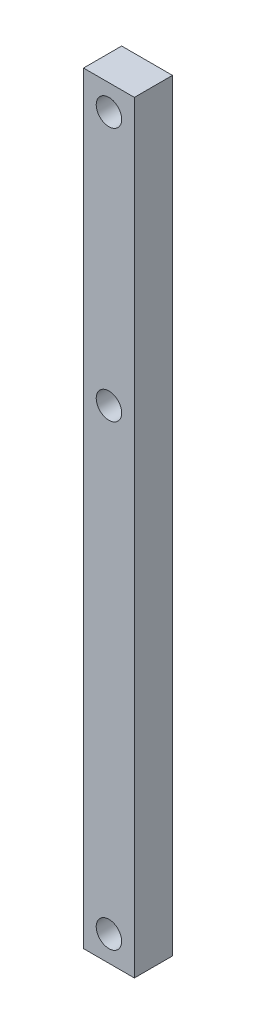
ISO-10303-21;
HEADER;
FILE_DESCRIPTION(('STEP AP214'),'2;1');
FILE_NAME('part.step','',(''),(''),'','','');
FILE_SCHEMA(('AUTOMOTIVE_DESIGN { 1 0 10303 214 1 1 1 1 }'));
ENDSEC;
DATA;
#1=APPLICATION_CONTEXT('core data for automotive mechanical design processes');
#2=APPLICATION_PROTOCOL_DEFINITION('international standard','automotive_design',2000,#1);
#3=PRODUCT_CONTEXT('',#1,'mechanical');
#4=PRODUCT('Part','Part','',(#3));
#5=PRODUCT_RELATED_PRODUCT_CATEGORY('part','',(#4));
#6=PRODUCT_DEFINITION_FORMATION('','',#4);
#7=PRODUCT_DEFINITION_CONTEXT('part definition',#1,'design');
#8=PRODUCT_DEFINITION('design','',#6,#7);
#9=PRODUCT_DEFINITION_SHAPE('','',#8);
#10=(LENGTH_UNIT() NAMED_UNIT(*) SI_UNIT(.MILLI.,.METRE.));
#11=(NAMED_UNIT(*) PLANE_ANGLE_UNIT() SI_UNIT($,.RADIAN.));
#12=(NAMED_UNIT(*) SI_UNIT($,.STERADIAN.) SOLID_ANGLE_UNIT());
#13=UNCERTAINTY_MEASURE_WITH_UNIT(LENGTH_MEASURE(1.E-05),#10,'distance_accuracy_value','');
#14=(GEOMETRIC_REPRESENTATION_CONTEXT(3) GLOBAL_UNCERTAINTY_ASSIGNED_CONTEXT((#13)) GLOBAL_UNIT_ASSIGNED_CONTEXT((#10,
#11,#12)) REPRESENTATION_CONTEXT('',''));
#15=CARTESIAN_POINT('',(0.,0.,0.));
#16=DIRECTION('',(0.,0.,1.));
#17=DIRECTION('',(1.,0.,0.));
#18=AXIS2_PLACEMENT_3D('',#15,#16,#17);
#19=CARTESIAN_POINT('',(9.99999999999998,150.,15.));
#20=DIRECTION('',(-1.,0.,0.));
#21=DIRECTION('',(0.,-1.,0.));
#22=AXIS2_PLACEMENT_3D('',#19,#20,#21);
#23=PLANE('',#22);
#24=DIRECTION('',(0.,1.,0.));
#25=VECTOR('',#24,1.);
#26=CARTESIAN_POINT('',(9.99999999999998,150.,0.));
#27=LINE('',#26,#25);
#28=CARTESIAN_POINT('',(10.,-150.,0.));
#29=VERTEX_POINT('',#28);
#30=CARTESIAN_POINT('',(9.99999999999998,150.,0.));
#31=VERTEX_POINT('',#30);
#32=EDGE_CURVE('E107',#29,#31,#27,.T.);
#33=ORIENTED_EDGE('',*,*,#32,.T.);
#34=DIRECTION('',(0.,0.,-1.));
#35=VECTOR('',#34,1.);
#36=CARTESIAN_POINT('',(9.99999999999998,150.,15.));
#37=LINE('',#36,#35);
#38=CARTESIAN_POINT('',(9.99999999999998,150.,15.));
#39=VERTEX_POINT('',#38);
#40=EDGE_CURVE('E11',#39,#31,#37,.T.);
#41=ORIENTED_EDGE('',*,*,#40,.F.);
#42=DIRECTION('',(0.,1.,0.));
#43=VECTOR('',#42,1.);
#44=CARTESIAN_POINT('',(9.99999999999998,150.,15.));
#45=LINE('',#44,#43);
#46=CARTESIAN_POINT('',(10.,-150.,15.));
#47=VERTEX_POINT('',#46);
#48=EDGE_CURVE('E91',#47,#39,#45,.T.);
#49=ORIENTED_EDGE('',*,*,#48,.F.);
#50=DIRECTION('',(0.,0.,-1.));
#51=VECTOR('',#50,1.);
#52=CARTESIAN_POINT('',(10.,-150.,15.));
#53=LINE('',#52,#51);
#54=EDGE_CURVE('E103',#47,#29,#53,.T.);
#55=ORIENTED_EDGE('',*,*,#54,.T.);
#56=EDGE_LOOP('',(#33,#41,#49,#55));
#57=FACE_BOUND('',#56,.T.);
#58=ADVANCED_FACE('F39',(#57),#23,.F.);
#59=CARTESIAN_POINT('',(-10.,150.,15.));
#60=DIRECTION('',(0.,-1.,0.));
#61=DIRECTION('',(0.,0.,-1.));
#62=AXIS2_PLACEMENT_3D('',#59,#60,#61);
#63=PLANE('',#62);
#64=DIRECTION('',(-1.,0.,0.));
#65=VECTOR('',#64,1.);
#66=CARTESIAN_POINT('',(-10.,150.,0.));
#67=LINE('',#66,#65);
#68=CARTESIAN_POINT('',(-10.,150.,0.));
#69=VERTEX_POINT('',#68);
#70=EDGE_CURVE('E96',#31,#69,#67,.T.);
#71=ORIENTED_EDGE('',*,*,#70,.T.);
#72=DIRECTION('',(0.,0.,-1.));
#73=VECTOR('',#72,1.);
#74=CARTESIAN_POINT('',(-10.,150.,15.));
#75=LINE('',#74,#73);
#76=CARTESIAN_POINT('',(-10.,150.,15.));
#77=VERTEX_POINT('',#76);
#78=EDGE_CURVE('E48',#77,#69,#75,.T.);
#79=ORIENTED_EDGE('',*,*,#78,.F.);
#80=DIRECTION('',(-1.,0.,0.));
#81=VECTOR('',#80,1.);
#82=CARTESIAN_POINT('',(-10.,150.,15.));
#83=LINE('',#82,#81);
#84=EDGE_CURVE('E86',#39,#77,#83,.T.);
#85=ORIENTED_EDGE('',*,*,#84,.F.);
#86=ORIENTED_EDGE('',*,*,#40,.T.);
#87=EDGE_LOOP('',(#71,#79,#85,#86));
#88=FACE_BOUND('',#87,.T.);
#89=ADVANCED_FACE('F95',(#88),#63,.F.);
#90=CARTESIAN_POINT('',(-10.,150.,15.));
#91=DIRECTION('',(1.,0.,0.));
#92=DIRECTION('',(0.,1.,0.));
#93=AXIS2_PLACEMENT_3D('',#90,#91,#92);
#94=PLANE('',#93);
#95=DIRECTION('',(0.,-1.,0.));
#96=VECTOR('',#95,1.);
#97=CARTESIAN_POINT('',(-10.,150.,0.));
#98=LINE('',#97,#96);
#99=CARTESIAN_POINT('',(-9.99999999999998,-150.,0.));
#100=VERTEX_POINT('',#99);
#101=EDGE_CURVE('E73',#69,#100,#98,.T.);
#102=ORIENTED_EDGE('',*,*,#101,.T.);
#103=DIRECTION('',(0.,0.,-1.));
#104=VECTOR('',#103,1.);
#105=CARTESIAN_POINT('',(-9.99999999999998,-150.,15.));
#106=LINE('',#105,#104);
#107=CARTESIAN_POINT('',(-9.99999999999998,-150.,15.));
#108=VERTEX_POINT('',#107);
#109=EDGE_CURVE('E98',#108,#100,#106,.T.);
#110=ORIENTED_EDGE('',*,*,#109,.F.);
#111=DIRECTION('',(0.,-1.,0.));
#112=VECTOR('',#111,1.);
#113=CARTESIAN_POINT('',(-10.,150.,15.));
#114=LINE('',#113,#112);
#115=EDGE_CURVE('E89',#77,#108,#114,.T.);
#116=ORIENTED_EDGE('',*,*,#115,.F.);
#117=ORIENTED_EDGE('',*,*,#78,.T.);
#118=EDGE_LOOP('',(#102,#110,#116,#117));
#119=FACE_BOUND('',#118,.T.);
#120=ADVANCED_FACE('F99',(#119),#94,.F.);
#121=CARTESIAN_POINT('',(-9.99999999999998,-150.,15.));
#122=DIRECTION('',(0.,1.,0.));
#123=DIRECTION('',(0.,0.,1.));
#124=AXIS2_PLACEMENT_3D('',#121,#122,#123);
#125=PLANE('',#124);
#126=DIRECTION('',(1.,0.,0.));
#127=VECTOR('',#126,1.);
#128=CARTESIAN_POINT('',(-9.99999999999998,-150.,0.));
#129=LINE('',#128,#127);
#130=EDGE_CURVE('E79',#100,#29,#129,.T.);
#131=ORIENTED_EDGE('',*,*,#130,.T.);
#132=ORIENTED_EDGE('',*,*,#54,.F.);
#133=DIRECTION('',(1.,0.,0.));
#134=VECTOR('',#133,1.);
#135=CARTESIAN_POINT('',(-9.99999999999998,-150.,15.));
#136=LINE('',#135,#134);
#137=EDGE_CURVE('E56',#108,#47,#136,.T.);
#138=ORIENTED_EDGE('',*,*,#137,.F.);
#139=ORIENTED_EDGE('',*,*,#109,.T.);
#140=EDGE_LOOP('',(#131,#132,#138,#139));
#141=FACE_BOUND('',#140,.T.);
#142=ADVANCED_FACE('F121',(#141),#125,.F.);
#143=CARTESIAN_POINT('',(0.,0.,15.));
#144=DIRECTION('',(0.,0.,1.));
#145=DIRECTION('',(1.,0.,0.));
#146=AXIS2_PLACEMENT_3D('',#143,#144,#145);
#147=PLANE('',#146);
#148=CARTESIAN_POINT('',(0.,140.,15.));
#149=DIRECTION('',(0.,0.,1.));
#150=DIRECTION('',(1.,0.,0.));
#151=AXIS2_PLACEMENT_3D('',#148,#149,#150);
#152=CIRCLE('',#151,5.);
#153=CARTESIAN_POINT('',(5.,140.,15.));
#154=VERTEX_POINT('',#153);
#155=EDGE_CURVE('E144',#154,#154,#152,.T.);
#156=ORIENTED_EDGE('',*,*,#155,.F.);
#157=EDGE_LOOP('',(#156));
#158=FACE_BOUND('',#157,.T.);
#159=CARTESIAN_POINT('',(0.,-140.,15.));
#160=DIRECTION('',(0.,0.,1.));
#161=DIRECTION('',(1.,0.,0.));
#162=AXIS2_PLACEMENT_3D('',#159,#160,#161);
#163=CIRCLE('',#162,5.00000000000001);
#164=CARTESIAN_POINT('',(5.00000000000001,-140.,15.));
#165=VERTEX_POINT('',#164);
#166=EDGE_CURVE('E136',#165,#165,#163,.T.);
#167=ORIENTED_EDGE('',*,*,#166,.F.);
#168=EDGE_LOOP('',(#167));
#169=FACE_BOUND('',#168,.T.);
#170=CARTESIAN_POINT('',(0.,40.,15.));
#171=DIRECTION('',(0.,0.,1.));
#172=DIRECTION('',(1.,0.,0.));
#173=AXIS2_PLACEMENT_3D('',#170,#171,#172);
#174=CIRCLE('',#173,5.);
#175=CARTESIAN_POINT('',(5.,40.,15.));
#176=VERTEX_POINT('',#175);
#177=EDGE_CURVE('E128',#176,#176,#174,.T.);
#178=ORIENTED_EDGE('',*,*,#177,.F.);
#179=EDGE_LOOP('',(#178));
#180=FACE_BOUND('',#179,.T.);
#181=ORIENTED_EDGE('',*,*,#48,.T.);
#182=ORIENTED_EDGE('',*,*,#84,.T.);
#183=ORIENTED_EDGE('',*,*,#115,.T.);
#184=ORIENTED_EDGE('',*,*,#137,.T.);
#185=EDGE_LOOP('',(#181,#182,#183,#184));
#186=FACE_BOUND('',#185,.T.);
#187=ADVANCED_FACE('F87',(#158,#169,#180,#186),#147,.T.);
#188=CARTESIAN_POINT('',(0.,0.,0.));
#189=DIRECTION('',(0.,0.,1.));
#190=DIRECTION('',(1.,0.,0.));
#191=AXIS2_PLACEMENT_3D('',#188,#189,#190);
#192=PLANE('',#191);
#193=CARTESIAN_POINT('',(0.,140.,0.));
#194=DIRECTION('',(0.,0.,1.));
#195=DIRECTION('',(1.,0.,0.));
#196=AXIS2_PLACEMENT_3D('',#193,#194,#195);
#197=CIRCLE('',#196,5.);
#198=CARTESIAN_POINT('',(5.,140.,0.));
#199=VERTEX_POINT('',#198);
#200=EDGE_CURVE('E111',#199,#199,#197,.T.);
#201=ORIENTED_EDGE('',*,*,#200,.T.);
#202=EDGE_LOOP('',(#201));
#203=FACE_BOUND('',#202,.T.);
#204=CARTESIAN_POINT('',(0.,-140.,0.));
#205=DIRECTION('',(0.,0.,1.));
#206=DIRECTION('',(1.,0.,0.));
#207=AXIS2_PLACEMENT_3D('',#204,#205,#206);
#208=CIRCLE('',#207,5.00000000000001);
#209=CARTESIAN_POINT('',(5.00000000000001,-140.,0.));
#210=VERTEX_POINT('',#209);
#211=EDGE_CURVE('E140',#210,#210,#208,.T.);
#212=ORIENTED_EDGE('',*,*,#211,.T.);
#213=EDGE_LOOP('',(#212));
#214=FACE_BOUND('',#213,.T.);
#215=CARTESIAN_POINT('',(0.,40.,0.));
#216=DIRECTION('',(0.,0.,1.));
#217=DIRECTION('',(1.,0.,0.));
#218=AXIS2_PLACEMENT_3D('',#215,#216,#217);
#219=CIRCLE('',#218,5.);
#220=CARTESIAN_POINT('',(5.,40.,0.));
#221=VERTEX_POINT('',#220);
#222=EDGE_CURVE('E132',#221,#221,#219,.T.);
#223=ORIENTED_EDGE('',*,*,#222,.T.);
#224=EDGE_LOOP('',(#223));
#225=FACE_BOUND('',#224,.T.);
#226=ORIENTED_EDGE('',*,*,#32,.F.);
#227=ORIENTED_EDGE('',*,*,#130,.F.);
#228=ORIENTED_EDGE('',*,*,#101,.F.);
#229=ORIENTED_EDGE('',*,*,#70,.F.);
#230=EDGE_LOOP('',(#226,#227,#228,#229));
#231=FACE_BOUND('',#230,.T.);
#232=ADVANCED_FACE('F124',(#203,#214,#225,#231),#192,.F.);
#233=CARTESIAN_POINT('',(0.,40.,0.));
#234=DIRECTION('',(0.,0.,1.));
#235=DIRECTION('',(1.,0.,0.));
#236=AXIS2_PLACEMENT_3D('',#233,#234,#235);
#237=CYLINDRICAL_SURFACE('',#236,5.);
#238=ORIENTED_EDGE('',*,*,#222,.F.);
#239=EDGE_LOOP('',(#238));
#240=FACE_BOUND('',#239,.T.);
#241=ORIENTED_EDGE('',*,*,#177,.T.);
#242=EDGE_LOOP('',(#241));
#243=FACE_BOUND('',#242,.T.);
#244=ADVANCED_FACE('F168',(#240,#243),#237,.F.);
#245=CARTESIAN_POINT('',(0.,-140.,0.));
#246=DIRECTION('',(0.,0.,1.));
#247=DIRECTION('',(1.,0.,0.));
#248=AXIS2_PLACEMENT_3D('',#245,#246,#247);
#249=CYLINDRICAL_SURFACE('',#248,5.00000000000001);
#250=ORIENTED_EDGE('',*,*,#211,.F.);
#251=EDGE_LOOP('',(#250));
#252=FACE_BOUND('',#251,.T.);
#253=ORIENTED_EDGE('',*,*,#166,.T.);
#254=EDGE_LOOP('',(#253));
#255=FACE_BOUND('',#254,.T.);
#256=ADVANCED_FACE('F157',(#252,#255),#249,.F.);
#257=CARTESIAN_POINT('',(0.,140.,0.));
#258=DIRECTION('',(0.,0.,1.));
#259=DIRECTION('',(1.,0.,0.));
#260=AXIS2_PLACEMENT_3D('',#257,#258,#259);
#261=CYLINDRICAL_SURFACE('',#260,5.);
#262=ORIENTED_EDGE('',*,*,#200,.F.);
#263=EDGE_LOOP('',(#262));
#264=FACE_BOUND('',#263,.T.);
#265=ORIENTED_EDGE('',*,*,#155,.T.);
#266=EDGE_LOOP('',(#265));
#267=FACE_BOUND('',#266,.T.);
#268=ADVANCED_FACE('F154',(#264,#267),#261,.F.);
#269=CLOSED_SHELL('',(#58,#89,#120,#142,#187,#232,#244,#256,#268));
#270=MANIFOLD_SOLID_BREP('B2',#269);
#271=ADVANCED_BREP_SHAPE_REPRESENTATION('',(#18,#270),#14);
#272=SHAPE_DEFINITION_REPRESENTATION(#9,#271);
ENDSEC;
END-ISO-10303-21;
